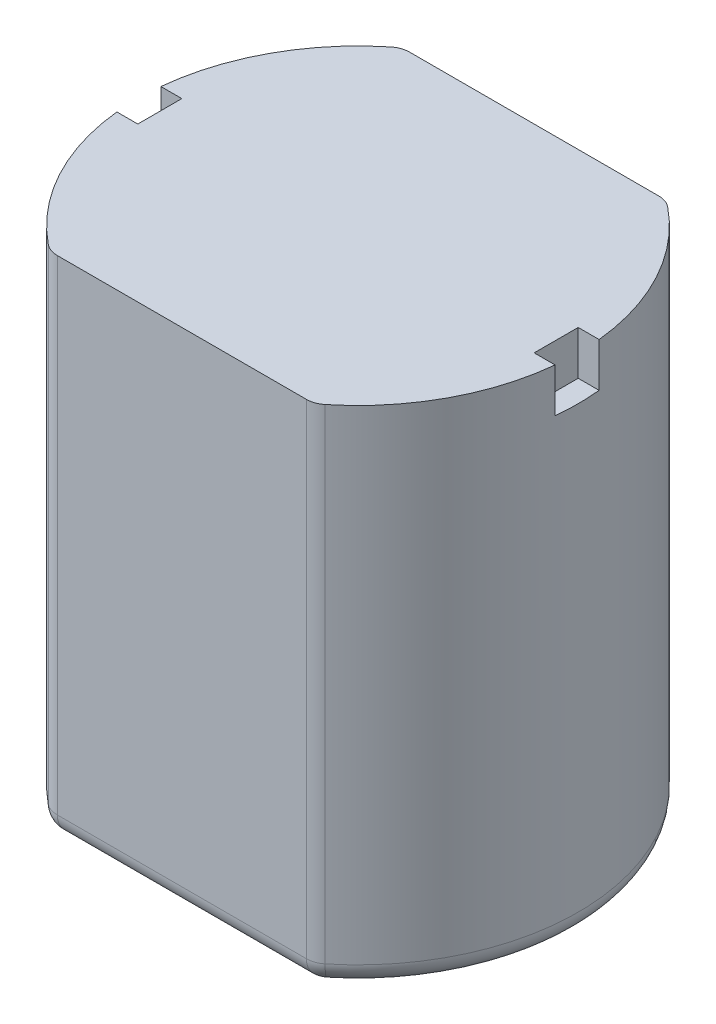
ISO-10303-21;
HEADER;
FILE_DESCRIPTION(('STEP AP214'),'2;1');
FILE_NAME('part.step','',(''),(''),'','','');
FILE_SCHEMA(('AUTOMOTIVE_DESIGN { 1 0 10303 214 1 1 1 1 }'));
ENDSEC;
DATA;
#1=APPLICATION_CONTEXT('core data for automotive mechanical design processes');
#2=APPLICATION_PROTOCOL_DEFINITION('international standard','automotive_design',2000,#1);
#3=PRODUCT_CONTEXT('',#1,'mechanical');
#4=PRODUCT('Part','Part','',(#3));
#5=PRODUCT_RELATED_PRODUCT_CATEGORY('part','',(#4));
#6=PRODUCT_DEFINITION_FORMATION('','',#4);
#7=PRODUCT_DEFINITION_CONTEXT('part definition',#1,'design');
#8=PRODUCT_DEFINITION('design','',#6,#7);
#9=PRODUCT_DEFINITION_SHAPE('','',#8);
#10=(LENGTH_UNIT() NAMED_UNIT(*) SI_UNIT(.MILLI.,.METRE.));
#11=(NAMED_UNIT(*) PLANE_ANGLE_UNIT() SI_UNIT($,.RADIAN.));
#12=(NAMED_UNIT(*) SI_UNIT($,.STERADIAN.) SOLID_ANGLE_UNIT());
#13=UNCERTAINTY_MEASURE_WITH_UNIT(LENGTH_MEASURE(1.E-05),#10,'distance_accuracy_value','');
#14=(GEOMETRIC_REPRESENTATION_CONTEXT(3) GLOBAL_UNCERTAINTY_ASSIGNED_CONTEXT((#13)) GLOBAL_UNIT_ASSIGNED_CONTEXT((#10,
#11,#12)) REPRESENTATION_CONTEXT('',''));
#15=CARTESIAN_POINT('',(0.,0.,0.));
#16=DIRECTION('',(0.,0.,1.));
#17=DIRECTION('',(1.,0.,0.));
#18=AXIS2_PLACEMENT_3D('',#15,#16,#17);
#19=CARTESIAN_POINT('',(0.,11.5,0.));
#20=DIRECTION('',(0.,-1.,0.));
#21=DIRECTION('',(0.,0.,-1.));
#22=AXIS2_PLACEMENT_3D('',#19,#20,#21);
#23=CYLINDRICAL_SURFACE('',#22,5.);
#24=DIRECTION('',(0.,-1.,0.));
#25=VECTOR('',#24,1.);
#26=CARTESIAN_POINT('',(-3.14269680527354,11.5,-3.88888888888889));
#27=LINE('',#26,#25);
#28=CARTESIAN_POINT('',(-3.14269680527354,11.5,-3.88888888888889));
#29=VERTEX_POINT('',#28);
#30=CARTESIAN_POINT('',(-3.14269680527354,0.5,-3.88888888888889));
#31=VERTEX_POINT('',#30);
#32=EDGE_CURVE('E248',#29,#31,#27,.T.);
#33=ORIENTED_EDGE('',*,*,#32,.T.);
#34=CARTESIAN_POINT('',(0.,0.5,0.));
#35=DIRECTION('',(0.,1.,0.));
#36=DIRECTION('',(0.,0.,1.));
#37=AXIS2_PLACEMENT_3D('',#34,#35,#36);
#38=CIRCLE('',#37,5.);
#39=CARTESIAN_POINT('',(-3.14269680527354,0.5,3.88888888888889));
#40=VERTEX_POINT('',#39);
#41=EDGE_CURVE('E45',#31,#40,#38,.T.);
#42=ORIENTED_EDGE('',*,*,#41,.T.);
#43=DIRECTION('',(0.,-1.,0.));
#44=VECTOR('',#43,1.);
#45=CARTESIAN_POINT('',(-3.14269680527354,11.5,3.88888888888889));
#46=LINE('',#45,#44);
#47=CARTESIAN_POINT('',(-3.14269680527354,11.5,3.88888888888889));
#48=VERTEX_POINT('',#47);
#49=EDGE_CURVE('E246',#40,#48,#46,.F.);
#50=ORIENTED_EDGE('',*,*,#49,.T.);
#51=CARTESIAN_POINT('',(0.,11.5,0.));
#52=DIRECTION('',(0.,1.,0.));
#53=DIRECTION('',(0.,0.,1.));
#54=AXIS2_PLACEMENT_3D('',#51,#52,#53);
#55=CIRCLE('',#54,5.);
#56=CARTESIAN_POINT('',(-4.9749371855331,11.5,0.5));
#57=VERTEX_POINT('',#56);
#58=EDGE_CURVE('E239',#57,#48,#55,.T.);
#59=ORIENTED_EDGE('',*,*,#58,.F.);
#60=DIRECTION('',(0.,-1.,0.));
#61=VECTOR('',#60,1.);
#62=CARTESIAN_POINT('',(-4.9749371855331,11.5,0.5));
#63=LINE('',#62,#61);
#64=CARTESIAN_POINT('',(-4.9749371855331,10.5,0.5));
#65=VERTEX_POINT('',#64);
#66=EDGE_CURVE('E199',#65,#57,#63,.F.);
#67=ORIENTED_EDGE('',*,*,#66,.F.);
#68=CARTESIAN_POINT('',(0.,10.5,0.));
#69=DIRECTION('',(0.,1.,0.));
#70=DIRECTION('',(0.,0.,1.));
#71=AXIS2_PLACEMENT_3D('',#68,#69,#70);
#72=CIRCLE('',#71,5.);
#73=CARTESIAN_POINT('',(-4.9749371855331,10.5,-0.5));
#74=VERTEX_POINT('',#73);
#75=EDGE_CURVE('E244',#74,#65,#72,.T.);
#76=ORIENTED_EDGE('',*,*,#75,.F.);
#77=DIRECTION('',(0.,-1.,0.));
#78=VECTOR('',#77,1.);
#79=CARTESIAN_POINT('',(-4.9749371855331,11.5,-0.5));
#80=LINE('',#79,#78);
#81=CARTESIAN_POINT('',(-4.9749371855331,11.5,-0.5));
#82=VERTEX_POINT('',#81);
#83=EDGE_CURVE('E197',#82,#74,#80,.T.);
#84=ORIENTED_EDGE('',*,*,#83,.F.);
#85=EDGE_CURVE('E189',#29,#82,#55,.T.);
#86=ORIENTED_EDGE('',*,*,#85,.F.);
#87=EDGE_LOOP('',(#33,#42,#50,#59,#67,#76,#84,#86));
#88=FACE_BOUND('',#87,.T.);
#89=ADVANCED_FACE('F37',(#88),#23,.T.);
#90=CARTESIAN_POINT('',(0.,11.5,0.));
#91=DIRECTION('',(0.,1.,0.));
#92=DIRECTION('',(0.,0.,1.));
#93=AXIS2_PLACEMENT_3D('',#90,#91,#92);
#94=PLANE('',#93);
#95=DIRECTION('',(1.,0.,0.));
#96=VECTOR('',#95,1.);
#97=CARTESIAN_POINT('',(-3.,11.5,-4.));
#98=LINE('',#97,#96);
#99=CARTESIAN_POINT('',(-2.82842712474619,11.5,-4.));
#100=VERTEX_POINT('',#99);
#101=CARTESIAN_POINT('',(2.82842712474619,11.5,-4.));
#102=VERTEX_POINT('',#101);
#103=EDGE_CURVE('E230',#100,#102,#98,.T.);
#104=ORIENTED_EDGE('',*,*,#103,.F.);
#105=CARTESIAN_POINT('',(-2.82842712474619,11.5,-3.5));
#106=DIRECTION('',(0.,1.,0.));
#107=DIRECTION('',(0.,0.,1.));
#108=AXIS2_PLACEMENT_3D('',#105,#106,#107);
#109=CIRCLE('',#108,0.5);
#110=EDGE_CURVE('E260',#100,#29,#109,.T.);
#111=ORIENTED_EDGE('',*,*,#110,.T.);
#112=ORIENTED_EDGE('',*,*,#85,.T.);
#113=DIRECTION('',(-1.,0.,0.));
#114=VECTOR('',#113,1.);
#115=CARTESIAN_POINT('',(-4.5,11.5,-0.5));
#116=LINE('',#115,#114);
#117=CARTESIAN_POINT('',(-4.5,11.5,-0.5));
#118=VERTEX_POINT('',#117);
#119=EDGE_CURVE('E170',#118,#82,#116,.T.);
#120=ORIENTED_EDGE('',*,*,#119,.F.);
#121=DIRECTION('',(0.,0.,1.));
#122=VECTOR('',#121,1.);
#123=CARTESIAN_POINT('',(-4.5,11.5,0.5));
#124=LINE('',#123,#122);
#125=CARTESIAN_POINT('',(-4.5,11.5,0.5));
#126=VERTEX_POINT('',#125);
#127=EDGE_CURVE('E176',#118,#126,#124,.T.);
#128=ORIENTED_EDGE('',*,*,#127,.T.);
#129=DIRECTION('',(-1.,0.,0.));
#130=VECTOR('',#129,1.);
#131=CARTESIAN_POINT('',(-4.5,11.5,0.5));
#132=LINE('',#131,#130);
#133=EDGE_CURVE('E190',#126,#57,#132,.T.);
#134=ORIENTED_EDGE('',*,*,#133,.T.);
#135=ORIENTED_EDGE('',*,*,#58,.T.);
#136=CARTESIAN_POINT('',(-2.82842712474619,11.5,3.5));
#137=DIRECTION('',(0.,1.,0.));
#138=DIRECTION('',(0.,0.,1.));
#139=AXIS2_PLACEMENT_3D('',#136,#137,#138);
#140=CIRCLE('',#139,0.5);
#141=CARTESIAN_POINT('',(-2.82842712474619,11.5,4.));
#142=VERTEX_POINT('',#141);
#143=EDGE_CURVE('E256',#48,#142,#140,.T.);
#144=ORIENTED_EDGE('',*,*,#143,.T.);
#145=DIRECTION('',(1.,0.,0.));
#146=VECTOR('',#145,1.);
#147=CARTESIAN_POINT('',(-3.,11.5,4.));
#148=LINE('',#147,#146);
#149=CARTESIAN_POINT('',(2.82842712474619,11.5,4.));
#150=VERTEX_POINT('',#149);
#151=EDGE_CURVE('E236',#142,#150,#148,.T.);
#152=ORIENTED_EDGE('',*,*,#151,.T.);
#153=CARTESIAN_POINT('',(2.82842712474619,11.5,3.5));
#154=DIRECTION('',(0.,1.,0.));
#155=DIRECTION('',(0.,0.,1.));
#156=AXIS2_PLACEMENT_3D('',#153,#154,#155);
#157=CIRCLE('',#156,0.5);
#158=CARTESIAN_POINT('',(3.14269680527354,11.5,3.88888888888889));
#159=VERTEX_POINT('',#158);
#160=EDGE_CURVE('E254',#150,#159,#157,.T.);
#161=ORIENTED_EDGE('',*,*,#160,.T.);
#162=CARTESIAN_POINT('',(0.,11.5,0.));
#163=DIRECTION('',(0.,1.,0.));
#164=DIRECTION('',(0.,0.,1.));
#165=AXIS2_PLACEMENT_3D('',#162,#163,#164);
#166=CIRCLE('',#165,5.);
#167=CARTESIAN_POINT('',(4.9749371855331,11.5,0.5));
#168=VERTEX_POINT('',#167);
#169=EDGE_CURVE('E234',#159,#168,#166,.T.);
#170=ORIENTED_EDGE('',*,*,#169,.T.);
#171=DIRECTION('',(1.,0.,0.));
#172=VECTOR('',#171,1.);
#173=CARTESIAN_POINT('',(4.5,11.5,0.5));
#174=LINE('',#173,#172);
#175=CARTESIAN_POINT('',(4.5,11.5,0.5));
#176=VERTEX_POINT('',#175);
#177=EDGE_CURVE('E213',#176,#168,#174,.T.);
#178=ORIENTED_EDGE('',*,*,#177,.F.);
#179=DIRECTION('',(0.,0.,1.));
#180=VECTOR('',#179,1.);
#181=CARTESIAN_POINT('',(4.5,11.5,0.5));
#182=LINE('',#181,#180);
#183=CARTESIAN_POINT('',(4.5,11.5,-0.5));
#184=VERTEX_POINT('',#183);
#185=EDGE_CURVE('E209',#184,#176,#182,.T.);
#186=ORIENTED_EDGE('',*,*,#185,.F.);
#187=DIRECTION('',(1.,0.,0.));
#188=VECTOR('',#187,1.);
#189=CARTESIAN_POINT('',(4.5,11.5,-0.5));
#190=LINE('',#189,#188);
#191=CARTESIAN_POINT('',(4.9749371855331,11.5,-0.5));
#192=VERTEX_POINT('',#191);
#193=EDGE_CURVE('E217',#184,#192,#190,.T.);
#194=ORIENTED_EDGE('',*,*,#193,.T.);
#195=CARTESIAN_POINT('',(3.14269680527354,11.5,-3.88888888888889));
#196=VERTEX_POINT('',#195);
#197=EDGE_CURVE('E233',#192,#196,#166,.T.);
#198=ORIENTED_EDGE('',*,*,#197,.T.);
#199=CARTESIAN_POINT('',(2.82842712474619,11.5,-3.5));
#200=DIRECTION('',(0.,1.,0.));
#201=DIRECTION('',(0.,0.,1.));
#202=AXIS2_PLACEMENT_3D('',#199,#200,#201);
#203=CIRCLE('',#202,0.5);
#204=EDGE_CURVE('E258',#196,#102,#203,.T.);
#205=ORIENTED_EDGE('',*,*,#204,.T.);
#206=EDGE_LOOP('',(#104,#111,#112,#120,#128,#134,#135,#144,#152,#161,#170,#178,#186,#194,#198,#205));
#207=FACE_BOUND('',#206,.T.);
#208=ADVANCED_FACE('F187',(#207),#94,.T.);
#209=CARTESIAN_POINT('',(-3.,11.5,-4.));
#210=DIRECTION('',(0.,0.,-1.));
#211=DIRECTION('',(-1.,0.,0.));
#212=AXIS2_PLACEMENT_3D('',#209,#210,#211);
#213=PLANE('',#212);
#214=DIRECTION('',(0.,1.,0.));
#215=VECTOR('',#214,1.);
#216=CARTESIAN_POINT('',(2.82842712474619,0.,-4.));
#217=LINE('',#216,#215);
#218=CARTESIAN_POINT('',(2.82842712474619,0.5,-4.));
#219=VERTEX_POINT('',#218);
#220=EDGE_CURVE('E250',#102,#219,#217,.F.);
#221=ORIENTED_EDGE('',*,*,#220,.T.);
#222=DIRECTION('',(1.,0.,0.));
#223=VECTOR('',#222,1.);
#224=CARTESIAN_POINT('',(-2.82842712474619,0.5,-4.));
#225=LINE('',#224,#223);
#226=CARTESIAN_POINT('',(-2.82842712474619,0.5,-4.));
#227=VERTEX_POINT('',#226);
#228=EDGE_CURVE('E60',#219,#227,#225,.F.);
#229=ORIENTED_EDGE('',*,*,#228,.T.);
#230=DIRECTION('',(0.,1.,0.));
#231=VECTOR('',#230,1.);
#232=CARTESIAN_POINT('',(-2.82842712474619,11.5,-4.));
#233=LINE('',#232,#231);
#234=EDGE_CURVE('E252',#227,#100,#233,.T.);
#235=ORIENTED_EDGE('',*,*,#234,.T.);
#236=ORIENTED_EDGE('',*,*,#103,.T.);
#237=EDGE_LOOP('',(#221,#229,#235,#236));
#238=FACE_BOUND('',#237,.T.);
#239=ADVANCED_FACE('F376',(#238),#213,.T.);
#240=CARTESIAN_POINT('',(-3.,11.5,4.));
#241=DIRECTION('',(0.,0.,-1.));
#242=DIRECTION('',(-1.,0.,0.));
#243=AXIS2_PLACEMENT_3D('',#240,#241,#242);
#244=PLANE('',#243);
#245=DIRECTION('',(0.,-1.,0.));
#246=VECTOR('',#245,1.);
#247=CARTESIAN_POINT('',(-2.82842712474619,11.5,4.));
#248=LINE('',#247,#246);
#249=CARTESIAN_POINT('',(-2.82842712474619,0.5,4.));
#250=VERTEX_POINT('',#249);
#251=EDGE_CURVE('E269',#142,#250,#248,.T.);
#252=ORIENTED_EDGE('',*,*,#251,.T.);
#253=DIRECTION('',(1.,0.,0.));
#254=VECTOR('',#253,1.);
#255=CARTESIAN_POINT('',(-3.,0.5,4.));
#256=LINE('',#255,#254);
#257=CARTESIAN_POINT('',(2.82842712474619,0.5,4.));
#258=VERTEX_POINT('',#257);
#259=EDGE_CURVE('E275',#250,#258,#256,.T.);
#260=ORIENTED_EDGE('',*,*,#259,.T.);
#261=DIRECTION('',(0.,-1.,0.));
#262=VECTOR('',#261,1.);
#263=CARTESIAN_POINT('',(2.82842712474619,11.5,4.));
#264=LINE('',#263,#262);
#265=EDGE_CURVE('E267',#258,#150,#264,.F.);
#266=ORIENTED_EDGE('',*,*,#265,.T.);
#267=ORIENTED_EDGE('',*,*,#151,.F.);
#268=EDGE_LOOP('',(#252,#260,#266,#267));
#269=FACE_BOUND('',#268,.T.);
#270=ADVANCED_FACE('F341',(#269),#244,.F.);
#271=CARTESIAN_POINT('',(0.,11.5,0.));
#272=DIRECTION('',(0.,-1.,0.));
#273=DIRECTION('',(0.,0.,-1.));
#274=AXIS2_PLACEMENT_3D('',#271,#272,#273);
#275=CYLINDRICAL_SURFACE('',#274,5.);
#276=DIRECTION('',(0.,-1.,0.));
#277=VECTOR('',#276,1.);
#278=CARTESIAN_POINT('',(3.14269680527354,11.5,3.88888888888889));
#279=LINE('',#278,#277);
#280=CARTESIAN_POINT('',(3.14269680527354,0.5,3.88888888888889));
#281=VERTEX_POINT('',#280);
#282=EDGE_CURVE('E262',#159,#281,#279,.T.);
#283=ORIENTED_EDGE('',*,*,#282,.T.);
#284=CARTESIAN_POINT('',(0.,0.5,0.));
#285=DIRECTION('',(0.,1.,0.));
#286=DIRECTION('',(0.,0.,1.));
#287=AXIS2_PLACEMENT_3D('',#284,#285,#286);
#288=CIRCLE('',#287,5.);
#289=CARTESIAN_POINT('',(3.14269680527354,0.5,-3.88888888888889));
#290=VERTEX_POINT('',#289);
#291=EDGE_CURVE('E288',#281,#290,#288,.T.);
#292=ORIENTED_EDGE('',*,*,#291,.T.);
#293=DIRECTION('',(0.,-1.,0.));
#294=VECTOR('',#293,1.);
#295=CARTESIAN_POINT('',(3.14269680527354,11.5,-3.88888888888889));
#296=LINE('',#295,#294);
#297=EDGE_CURVE('E265',#290,#196,#296,.F.);
#298=ORIENTED_EDGE('',*,*,#297,.T.);
#299=ORIENTED_EDGE('',*,*,#197,.F.);
#300=DIRECTION('',(0.,-1.,0.));
#301=VECTOR('',#300,1.);
#302=CARTESIAN_POINT('',(4.9749371855331,11.5,-0.5));
#303=LINE('',#302,#301);
#304=CARTESIAN_POINT('',(4.9749371855331,10.5,-0.5));
#305=VERTEX_POINT('',#304);
#306=EDGE_CURVE('E216',#192,#305,#303,.T.);
#307=ORIENTED_EDGE('',*,*,#306,.T.);
#308=CARTESIAN_POINT('',(0.,10.5,0.));
#309=DIRECTION('',(0.,-1.,0.));
#310=DIRECTION('',(0.,0.,-1.));
#311=AXIS2_PLACEMENT_3D('',#308,#309,#310);
#312=CIRCLE('',#311,5.);
#313=CARTESIAN_POINT('',(4.9749371855331,10.5,0.5));
#314=VERTEX_POINT('',#313);
#315=EDGE_CURVE('E241',#305,#314,#312,.T.);
#316=ORIENTED_EDGE('',*,*,#315,.T.);
#317=DIRECTION('',(0.,-1.,0.));
#318=VECTOR('',#317,1.);
#319=CARTESIAN_POINT('',(4.9749371855331,11.5,0.5));
#320=LINE('',#319,#318);
#321=EDGE_CURVE('E227',#314,#168,#320,.F.);
#322=ORIENTED_EDGE('',*,*,#321,.T.);
#323=ORIENTED_EDGE('',*,*,#169,.F.);
#324=EDGE_LOOP('',(#283,#292,#298,#299,#307,#316,#322,#323));
#325=FACE_BOUND('',#324,.T.);
#326=ADVANCED_FACE('F351',(#325),#275,.T.);
#327=CARTESIAN_POINT('',(0.,0.,0.));
#328=DIRECTION('',(0.,1.,0.));
#329=DIRECTION('',(0.,0.,1.));
#330=AXIS2_PLACEMENT_3D('',#327,#328,#329);
#331=PLANE('',#330);
#332=CARTESIAN_POINT('',(-3.,0.,0.));
#333=DIRECTION('',(0.,-1.,0.));
#334=DIRECTION('',(0.,0.,-1.));
#335=AXIS2_PLACEMENT_3D('',#332,#333,#334);
#336=CIRCLE('',#335,0.376312748616978);
#337=CARTESIAN_POINT('',(-3.,0.,-0.376312748616978));
#338=VERTEX_POINT('',#337);
#339=EDGE_CURVE('E708',#338,#338,#336,.T.);
#340=ORIENTED_EDGE('',*,*,#339,.F.);
#341=EDGE_LOOP('',(#340));
#342=FACE_BOUND('',#341,.T.);
#343=CARTESIAN_POINT('',(3.,0.,0.));
#344=DIRECTION('',(0.,-1.,0.));
#345=DIRECTION('',(0.,0.,-1.));
#346=AXIS2_PLACEMENT_3D('',#343,#344,#345);
#347=CIRCLE('',#346,0.431953984557101);
#348=CARTESIAN_POINT('',(3.,0.,-0.431953984557101));
#349=VERTEX_POINT('',#348);
#350=EDGE_CURVE('E718',#349,#349,#347,.T.);
#351=ORIENTED_EDGE('',*,*,#350,.F.);
#352=EDGE_LOOP('',(#351));
#353=FACE_BOUND('',#352,.T.);
#354=CARTESIAN_POINT('',(0.,0.,0.));
#355=DIRECTION('',(0.,1.,0.));
#356=DIRECTION('',(0.,0.,1.));
#357=AXIS2_PLACEMENT_3D('',#354,#355,#356);
#358=CIRCLE('',#357,2.);
#359=CARTESIAN_POINT('',(0.,0.,2.));
#360=VERTEX_POINT('',#359);
#361=EDGE_CURVE('E11',#360,#360,#358,.F.);
#362=ORIENTED_EDGE('',*,*,#361,.F.);
#363=EDGE_LOOP('',(#362));
#364=FACE_BOUND('',#363,.T.);
#365=CARTESIAN_POINT('',(0.,0.,0.));
#366=DIRECTION('',(0.,1.,0.));
#367=DIRECTION('',(0.,0.,1.));
#368=AXIS2_PLACEMENT_3D('',#365,#366,#367);
#369=CIRCLE('',#368,4.5);
#370=CARTESIAN_POINT('',(2.82842712474619,0.,-3.5));
#371=VERTEX_POINT('',#370);
#372=CARTESIAN_POINT('',(2.82842712474619,0.,3.5));
#373=VERTEX_POINT('',#372);
#374=EDGE_CURVE('E281',#371,#373,#369,.F.);
#375=ORIENTED_EDGE('',*,*,#374,.T.);
#376=DIRECTION('',(1.,0.,0.));
#377=VECTOR('',#376,1.);
#378=CARTESIAN_POINT('',(0.,0.,3.5));
#379=LINE('',#378,#377);
#380=CARTESIAN_POINT('',(-2.82842712474619,0.,3.5));
#381=VERTEX_POINT('',#380);
#382=EDGE_CURVE('E283',#373,#381,#379,.F.);
#383=ORIENTED_EDGE('',*,*,#382,.T.);
#384=CARTESIAN_POINT('',(0.,0.,0.));
#385=DIRECTION('',(0.,1.,0.));
#386=DIRECTION('',(0.,0.,1.));
#387=AXIS2_PLACEMENT_3D('',#384,#385,#386);
#388=CIRCLE('',#387,4.5);
#389=CARTESIAN_POINT('',(-2.82842712474619,0.,-3.5));
#390=VERTEX_POINT('',#389);
#391=EDGE_CURVE('E277',#381,#390,#388,.F.);
#392=ORIENTED_EDGE('',*,*,#391,.T.);
#393=DIRECTION('',(1.,0.,0.));
#394=VECTOR('',#393,1.);
#395=CARTESIAN_POINT('',(2.82842712474619,0.,-3.5));
#396=LINE('',#395,#394);
#397=EDGE_CURVE('E279',#390,#371,#396,.T.);
#398=ORIENTED_EDGE('',*,*,#397,.T.);
#399=EDGE_LOOP('',(#375,#383,#392,#398));
#400=FACE_BOUND('',#399,.T.);
#401=ADVANCED_FACE('F364',(#342,#353,#364,#400),#331,.F.);
#402=CARTESIAN_POINT('',(4.5,10.5,0.5));
#403=DIRECTION('',(0.,-1.,0.));
#404=DIRECTION('',(0.,0.,-1.));
#405=AXIS2_PLACEMENT_3D('',#402,#403,#404);
#406=PLANE('',#405);
#407=DIRECTION('',(1.,0.,0.));
#408=VECTOR('',#407,1.);
#409=CARTESIAN_POINT('',(4.5,10.5,-0.5));
#410=LINE('',#409,#408);
#411=CARTESIAN_POINT('',(4.5,10.5,-0.5));
#412=VERTEX_POINT('',#411);
#413=EDGE_CURVE('E220',#412,#305,#410,.T.);
#414=ORIENTED_EDGE('',*,*,#413,.F.);
#415=DIRECTION('',(0.,0.,-1.));
#416=VECTOR('',#415,1.);
#417=CARTESIAN_POINT('',(4.5,10.5,0.5));
#418=LINE('',#417,#416);
#419=CARTESIAN_POINT('',(4.5,10.5,0.5));
#420=VERTEX_POINT('',#419);
#421=EDGE_CURVE('E204',#420,#412,#418,.T.);
#422=ORIENTED_EDGE('',*,*,#421,.F.);
#423=DIRECTION('',(1.,0.,0.));
#424=VECTOR('',#423,1.);
#425=CARTESIAN_POINT('',(4.5,10.5,0.5));
#426=LINE('',#425,#424);
#427=EDGE_CURVE('E212',#420,#314,#426,.T.);
#428=ORIENTED_EDGE('',*,*,#427,.T.);
#429=ORIENTED_EDGE('',*,*,#315,.F.);
#430=EDGE_LOOP('',(#414,#422,#428,#429));
#431=FACE_BOUND('',#430,.T.);
#432=ADVANCED_FACE('F499',(#431),#406,.F.);
#433=CARTESIAN_POINT('',(4.5,11.5,0.5));
#434=DIRECTION('',(0.,0.,1.));
#435=DIRECTION('',(0.,-1.,0.));
#436=AXIS2_PLACEMENT_3D('',#433,#434,#435);
#437=PLANE('',#436);
#438=ORIENTED_EDGE('',*,*,#427,.F.);
#439=DIRECTION('',(0.,-1.,0.));
#440=VECTOR('',#439,1.);
#441=CARTESIAN_POINT('',(4.5,11.5,0.5));
#442=LINE('',#441,#440);
#443=EDGE_CURVE('E201',#176,#420,#442,.T.);
#444=ORIENTED_EDGE('',*,*,#443,.F.);
#445=ORIENTED_EDGE('',*,*,#177,.T.);
#446=ORIENTED_EDGE('',*,*,#321,.F.);
#447=EDGE_LOOP('',(#438,#444,#445,#446));
#448=FACE_BOUND('',#447,.T.);
#449=ADVANCED_FACE('F560',(#448),#437,.F.);
#450=CARTESIAN_POINT('',(4.5,11.5,-0.5));
#451=DIRECTION('',(0.,0.,-1.));
#452=DIRECTION('',(0.,1.,0.));
#453=AXIS2_PLACEMENT_3D('',#450,#451,#452);
#454=PLANE('',#453);
#455=ORIENTED_EDGE('',*,*,#193,.F.);
#456=DIRECTION('',(0.,1.,0.));
#457=VECTOR('',#456,1.);
#458=CARTESIAN_POINT('',(4.5,11.5,-0.5));
#459=LINE('',#458,#457);
#460=EDGE_CURVE('E207',#412,#184,#459,.T.);
#461=ORIENTED_EDGE('',*,*,#460,.F.);
#462=ORIENTED_EDGE('',*,*,#413,.T.);
#463=ORIENTED_EDGE('',*,*,#306,.F.);
#464=EDGE_LOOP('',(#455,#461,#462,#463));
#465=FACE_BOUND('',#464,.T.);
#466=ADVANCED_FACE('F556',(#465),#454,.F.);
#467=CARTESIAN_POINT('',(4.5,0.,0.));
#468=DIRECTION('',(1.,0.,0.));
#469=DIRECTION('',(0.,0.,-1.));
#470=AXIS2_PLACEMENT_3D('',#467,#468,#469);
#471=PLANE('',#470);
#472=ORIENTED_EDGE('',*,*,#443,.T.);
#473=ORIENTED_EDGE('',*,*,#421,.T.);
#474=ORIENTED_EDGE('',*,*,#460,.T.);
#475=ORIENTED_EDGE('',*,*,#185,.T.);
#476=EDGE_LOOP('',(#472,#473,#474,#475));
#477=FACE_BOUND('',#476,.T.);
#478=ADVANCED_FACE('F549',(#477),#471,.T.);
#479=CARTESIAN_POINT('',(-4.5,10.5,0.5));
#480=DIRECTION('',(0.,1.,0.));
#481=DIRECTION('',(0.,0.,1.));
#482=AXIS2_PLACEMENT_3D('',#479,#480,#481);
#483=PLANE('',#482);
#484=DIRECTION('',(-1.,0.,0.));
#485=VECTOR('',#484,1.);
#486=CARTESIAN_POINT('',(-4.5,10.5,-0.5));
#487=LINE('',#486,#485);
#488=CARTESIAN_POINT('',(-4.5,10.5,-0.5));
#489=VERTEX_POINT('',#488);
#490=EDGE_CURVE('E173',#489,#74,#487,.T.);
#491=ORIENTED_EDGE('',*,*,#490,.T.);
#492=ORIENTED_EDGE('',*,*,#75,.T.);
#493=DIRECTION('',(-1.,0.,0.));
#494=VECTOR('',#493,1.);
#495=CARTESIAN_POINT('',(-4.5,10.5,0.5));
#496=LINE('',#495,#494);
#497=CARTESIAN_POINT('',(-4.5,10.5,0.5));
#498=VERTEX_POINT('',#497);
#499=EDGE_CURVE('E192',#498,#65,#496,.T.);
#500=ORIENTED_EDGE('',*,*,#499,.F.);
#501=DIRECTION('',(0.,0.,-1.));
#502=VECTOR('',#501,1.);
#503=CARTESIAN_POINT('',(-4.5,10.5,0.5));
#504=LINE('',#503,#502);
#505=EDGE_CURVE('E175',#498,#489,#504,.T.);
#506=ORIENTED_EDGE('',*,*,#505,.T.);
#507=EDGE_LOOP('',(#491,#492,#500,#506));
#508=FACE_BOUND('',#507,.T.);
#509=ADVANCED_FACE('F546',(#508),#483,.T.);
#510=CARTESIAN_POINT('',(-4.5,11.5,0.5));
#511=DIRECTION('',(0.,0.,-1.));
#512=DIRECTION('',(0.,1.,0.));
#513=AXIS2_PLACEMENT_3D('',#510,#511,#512);
#514=PLANE('',#513);
#515=ORIENTED_EDGE('',*,*,#66,.T.);
#516=ORIENTED_EDGE('',*,*,#133,.F.);
#517=DIRECTION('',(0.,-1.,0.));
#518=VECTOR('',#517,1.);
#519=CARTESIAN_POINT('',(-4.5,11.5,0.5));
#520=LINE('',#519,#518);
#521=EDGE_CURVE('E181',#126,#498,#520,.T.);
#522=ORIENTED_EDGE('',*,*,#521,.T.);
#523=ORIENTED_EDGE('',*,*,#499,.T.);
#524=EDGE_LOOP('',(#515,#516,#522,#523));
#525=FACE_BOUND('',#524,.T.);
#526=ADVANCED_FACE('F328',(#525),#514,.T.);
#527=CARTESIAN_POINT('',(-4.5,11.5,-0.5));
#528=DIRECTION('',(0.,0.,1.));
#529=DIRECTION('',(0.,-1.,0.));
#530=AXIS2_PLACEMENT_3D('',#527,#528,#529);
#531=PLANE('',#530);
#532=ORIENTED_EDGE('',*,*,#83,.T.);
#533=ORIENTED_EDGE('',*,*,#490,.F.);
#534=DIRECTION('',(0.,1.,0.));
#535=VECTOR('',#534,1.);
#536=CARTESIAN_POINT('',(-4.5,11.5,-0.5));
#537=LINE('',#536,#535);
#538=EDGE_CURVE('E165',#489,#118,#537,.T.);
#539=ORIENTED_EDGE('',*,*,#538,.T.);
#540=ORIENTED_EDGE('',*,*,#119,.T.);
#541=EDGE_LOOP('',(#532,#533,#539,#540));
#542=FACE_BOUND('',#541,.T.);
#543=ADVANCED_FACE('F168',(#542),#531,.T.);
#544=CARTESIAN_POINT('',(-4.5,0.,0.));
#545=DIRECTION('',(-1.,0.,0.));
#546=DIRECTION('',(0.,0.,-1.));
#547=AXIS2_PLACEMENT_3D('',#544,#545,#546);
#548=PLANE('',#547);
#549=ORIENTED_EDGE('',*,*,#521,.F.);
#550=ORIENTED_EDGE('',*,*,#127,.F.);
#551=ORIENTED_EDGE('',*,*,#538,.F.);
#552=ORIENTED_EDGE('',*,*,#505,.F.);
#553=EDGE_LOOP('',(#549,#550,#551,#552));
#554=FACE_BOUND('',#553,.T.);
#555=ADVANCED_FACE('F179',(#554),#548,.T.);
#556=CARTESIAN_POINT('',(-2.82842712474619,11.5,-3.5));
#557=DIRECTION('',(0.,-1.,0.));
#558=DIRECTION('',(0.,0.,-1.));
#559=AXIS2_PLACEMENT_3D('',#556,#557,#558);
#560=CYLINDRICAL_SURFACE('',#559,0.5);
#561=ORIENTED_EDGE('',*,*,#234,.F.);
#562=CARTESIAN_POINT('',(-2.82842712474619,0.5,-3.5));
#563=DIRECTION('',(0.,-1.,0.));
#564=DIRECTION('',(0.,0.,-1.));
#565=AXIS2_PLACEMENT_3D('',#562,#563,#564);
#566=CIRCLE('',#565,0.5);
#567=EDGE_CURVE('E52',#227,#31,#566,.F.);
#568=ORIENTED_EDGE('',*,*,#567,.T.);
#569=ORIENTED_EDGE('',*,*,#32,.F.);
#570=ORIENTED_EDGE('',*,*,#110,.F.);
#571=EDGE_LOOP('',(#561,#568,#569,#570));
#572=FACE_BOUND('',#571,.T.);
#573=ADVANCED_FACE('F379',(#572),#560,.T.);
#574=CARTESIAN_POINT('',(2.82842712474619,11.5,-3.5));
#575=DIRECTION('',(0.,-1.,0.));
#576=DIRECTION('',(0.,0.,-1.));
#577=AXIS2_PLACEMENT_3D('',#574,#575,#576);
#578=CYLINDRICAL_SURFACE('',#577,0.5);
#579=ORIENTED_EDGE('',*,*,#297,.F.);
#580=CARTESIAN_POINT('',(2.82842712474619,0.5,-3.5));
#581=DIRECTION('',(0.,-1.,0.));
#582=DIRECTION('',(0.,0.,-1.));
#583=AXIS2_PLACEMENT_3D('',#580,#581,#582);
#584=CIRCLE('',#583,0.5);
#585=EDGE_CURVE('E290',#290,#219,#584,.F.);
#586=ORIENTED_EDGE('',*,*,#585,.T.);
#587=ORIENTED_EDGE('',*,*,#220,.F.);
#588=ORIENTED_EDGE('',*,*,#204,.F.);
#589=EDGE_LOOP('',(#579,#586,#587,#588));
#590=FACE_BOUND('',#589,.T.);
#591=ADVANCED_FACE('F374',(#590),#578,.T.);
#592=CARTESIAN_POINT('',(-2.82842712474619,11.5,3.5));
#593=DIRECTION('',(0.,-1.,0.));
#594=DIRECTION('',(0.,0.,-1.));
#595=AXIS2_PLACEMENT_3D('',#592,#593,#594);
#596=CYLINDRICAL_SURFACE('',#595,0.5);
#597=ORIENTED_EDGE('',*,*,#49,.F.);
#598=CARTESIAN_POINT('',(-2.82842712474619,0.5,3.5));
#599=DIRECTION('',(0.,-1.,0.));
#600=DIRECTION('',(0.,0.,-1.));
#601=AXIS2_PLACEMENT_3D('',#598,#599,#600);
#602=CIRCLE('',#601,0.5);
#603=EDGE_CURVE('E272',#40,#250,#602,.F.);
#604=ORIENTED_EDGE('',*,*,#603,.T.);
#605=ORIENTED_EDGE('',*,*,#251,.F.);
#606=ORIENTED_EDGE('',*,*,#143,.F.);
#607=EDGE_LOOP('',(#597,#604,#605,#606));
#608=FACE_BOUND('',#607,.T.);
#609=ADVANCED_FACE('F338',(#608),#596,.T.);
#610=CARTESIAN_POINT('',(2.82842712474619,11.5,3.5));
#611=DIRECTION('',(0.,-1.,0.));
#612=DIRECTION('',(0.,0.,-1.));
#613=AXIS2_PLACEMENT_3D('',#610,#611,#612);
#614=CYLINDRICAL_SURFACE('',#613,0.5);
#615=ORIENTED_EDGE('',*,*,#265,.F.);
#616=CARTESIAN_POINT('',(2.82842712474619,0.5,3.5));
#617=DIRECTION('',(0.,-1.,0.));
#618=DIRECTION('',(0.,0.,-1.));
#619=AXIS2_PLACEMENT_3D('',#616,#617,#618);
#620=CIRCLE('',#619,0.5);
#621=EDGE_CURVE('E286',#258,#281,#620,.F.);
#622=ORIENTED_EDGE('',*,*,#621,.T.);
#623=ORIENTED_EDGE('',*,*,#282,.F.);
#624=ORIENTED_EDGE('',*,*,#160,.F.);
#625=EDGE_LOOP('',(#615,#622,#623,#624));
#626=FACE_BOUND('',#625,.T.);
#627=ADVANCED_FACE('F348',(#626),#614,.T.);
#628=CARTESIAN_POINT('',(2.82842712474619,0.5,-3.5));
#629=DIRECTION('',(0.,1.,0.));
#630=DIRECTION('',(0.,0.,1.));
#631=AXIS2_PLACEMENT_3D('',#628,#629,#630);
#632=SPHERICAL_SURFACE('',#631,0.5);
#633=CARTESIAN_POINT('',(2.82842712474619,0.5,-3.5));
#634=DIRECTION('',(-1.,0.,0.));
#635=DIRECTION('',(0.,0.,1.));
#636=AXIS2_PLACEMENT_3D('',#633,#634,#635);
#637=CIRCLE('',#636,0.5);
#638=EDGE_CURVE('E312',#219,#371,#637,.T.);
#639=ORIENTED_EDGE('',*,*,#638,.F.);
#640=ORIENTED_EDGE('',*,*,#585,.F.);
#641=CARTESIAN_POINT('',(2.82842712474619,0.5,-3.5));
#642=DIRECTION('',(0.777777777777778,0.,0.628539361054709));
#643=DIRECTION('',(0.628539361054709,0.,-0.777777777777778));
#644=AXIS2_PLACEMENT_3D('',#641,#642,#643);
#645=CIRCLE('',#644,0.5);
#646=EDGE_CURVE('E314',#371,#290,#645,.T.);
#647=ORIENTED_EDGE('',*,*,#646,.F.);
#648=EDGE_LOOP('',(#639,#640,#647));
#649=FACE_BOUND('',#648,.T.);
#650=ADVANCED_FACE('F39',(#649),#632,.T.);
#651=CARTESIAN_POINT('',(0.,0.5,0.));
#652=DIRECTION('',(0.,1.,0.));
#653=DIRECTION('',(0.,0.,1.));
#654=AXIS2_PLACEMENT_3D('',#651,#652,#653);
#655=TOROIDAL_SURFACE('',#654,4.5,0.5);
#656=ORIENTED_EDGE('',*,*,#646,.T.);
#657=ORIENTED_EDGE('',*,*,#291,.F.);
#658=CARTESIAN_POINT('',(2.82842712474619,0.5,3.5));
#659=DIRECTION('',(-0.777777777777778,0.,0.628539361054709));
#660=DIRECTION('',(0.628539361054709,0.,0.777777777777778));
#661=AXIS2_PLACEMENT_3D('',#658,#659,#660);
#662=CIRCLE('',#661,0.5);
#663=EDGE_CURVE('E309',#373,#281,#662,.T.);
#664=ORIENTED_EDGE('',*,*,#663,.F.);
#665=ORIENTED_EDGE('',*,*,#374,.F.);
#666=EDGE_LOOP('',(#656,#657,#664,#665));
#667=FACE_BOUND('',#666,.T.);
#668=ADVANCED_FACE('F354',(#667),#655,.T.);
#669=CARTESIAN_POINT('',(0.,0.5,-3.5));
#670=DIRECTION('',(-1.,0.,0.));
#671=DIRECTION('',(0.,0.,1.));
#672=AXIS2_PLACEMENT_3D('',#669,#670,#671);
#673=CYLINDRICAL_SURFACE('',#672,0.5);
#674=ORIENTED_EDGE('',*,*,#638,.T.);
#675=ORIENTED_EDGE('',*,*,#397,.F.);
#676=CARTESIAN_POINT('',(-2.82842712474619,0.5,-3.5));
#677=DIRECTION('',(-1.,0.,0.));
#678=DIRECTION('',(0.,0.,1.));
#679=AXIS2_PLACEMENT_3D('',#676,#677,#678);
#680=CIRCLE('',#679,0.5);
#681=EDGE_CURVE('E306',#227,#390,#680,.T.);
#682=ORIENTED_EDGE('',*,*,#681,.F.);
#683=ORIENTED_EDGE('',*,*,#228,.F.);
#684=EDGE_LOOP('',(#674,#675,#682,#683));
#685=FACE_BOUND('',#684,.T.);
#686=ADVANCED_FACE('F369',(#685),#673,.T.);
#687=CARTESIAN_POINT('',(2.82842712474619,0.5,3.5));
#688=DIRECTION('',(0.,1.,0.));
#689=DIRECTION('',(0.,0.,1.));
#690=AXIS2_PLACEMENT_3D('',#687,#688,#689);
#691=SPHERICAL_SURFACE('',#690,0.5);
#692=ORIENTED_EDGE('',*,*,#663,.T.);
#693=ORIENTED_EDGE('',*,*,#621,.F.);
#694=CARTESIAN_POINT('',(2.82842712474619,0.5,3.5));
#695=DIRECTION('',(-1.,0.,0.));
#696=DIRECTION('',(0.,0.,1.));
#697=AXIS2_PLACEMENT_3D('',#694,#695,#696);
#698=CIRCLE('',#697,0.5);
#699=EDGE_CURVE('E303',#373,#258,#698,.T.);
#700=ORIENTED_EDGE('',*,*,#699,.F.);
#701=EDGE_LOOP('',(#692,#693,#700));
#702=FACE_BOUND('',#701,.T.);
#703=ADVANCED_FACE('F357',(#702),#691,.T.);
#704=CARTESIAN_POINT('',(-2.82842712474619,0.5,-3.5));
#705=DIRECTION('',(0.,1.,0.));
#706=DIRECTION('',(0.,0.,1.));
#707=AXIS2_PLACEMENT_3D('',#704,#705,#706);
#708=SPHERICAL_SURFACE('',#707,0.5);
#709=ORIENTED_EDGE('',*,*,#567,.F.);
#710=ORIENTED_EDGE('',*,*,#681,.T.);
#711=CARTESIAN_POINT('',(-2.82842712474619,0.5,-3.5));
#712=DIRECTION('',(-0.777777777777778,0.,0.628539361054708));
#713=DIRECTION('',(0.628539361054709,0.,0.777777777777778));
#714=AXIS2_PLACEMENT_3D('',#711,#712,#713);
#715=CIRCLE('',#714,0.5);
#716=EDGE_CURVE('E300',#31,#390,#715,.T.);
#717=ORIENTED_EDGE('',*,*,#716,.F.);
#718=EDGE_LOOP('',(#709,#710,#717));
#719=FACE_BOUND('',#718,.T.);
#720=ADVANCED_FACE('F383',(#719),#708,.T.);
#721=CARTESIAN_POINT('',(-3.,0.5,3.5));
#722=DIRECTION('',(1.,0.,0.));
#723=DIRECTION('',(0.,0.,-1.));
#724=AXIS2_PLACEMENT_3D('',#721,#722,#723);
#725=CYLINDRICAL_SURFACE('',#724,0.5);
#726=ORIENTED_EDGE('',*,*,#699,.T.);
#727=ORIENTED_EDGE('',*,*,#259,.F.);
#728=CARTESIAN_POINT('',(-2.82842712474619,0.5,3.5));
#729=DIRECTION('',(-1.,0.,0.));
#730=DIRECTION('',(0.,0.,1.));
#731=AXIS2_PLACEMENT_3D('',#728,#729,#730);
#732=CIRCLE('',#731,0.5);
#733=EDGE_CURVE('E297',#381,#250,#732,.T.);
#734=ORIENTED_EDGE('',*,*,#733,.F.);
#735=ORIENTED_EDGE('',*,*,#382,.F.);
#736=EDGE_LOOP('',(#726,#727,#734,#735));
#737=FACE_BOUND('',#736,.T.);
#738=ADVANCED_FACE('F361',(#737),#725,.T.);
#739=CARTESIAN_POINT('',(0.,0.5,0.));
#740=DIRECTION('',(0.,1.,0.));
#741=DIRECTION('',(0.,0.,1.));
#742=AXIS2_PLACEMENT_3D('',#739,#740,#741);
#743=TOROIDAL_SURFACE('',#742,4.5,0.5);
#744=ORIENTED_EDGE('',*,*,#716,.T.);
#745=ORIENTED_EDGE('',*,*,#391,.F.);
#746=CARTESIAN_POINT('',(-2.82842712474619,0.5,3.5));
#747=DIRECTION('',(0.777777777777778,0.,0.628539361054709));
#748=DIRECTION('',(0.628539361054709,0.,-0.777777777777778));
#749=AXIS2_PLACEMENT_3D('',#746,#747,#748);
#750=CIRCLE('',#749,0.5);
#751=EDGE_CURVE('E295',#40,#381,#750,.T.);
#752=ORIENTED_EDGE('',*,*,#751,.F.);
#753=ORIENTED_EDGE('',*,*,#41,.F.);
#754=EDGE_LOOP('',(#744,#745,#752,#753));
#755=FACE_BOUND('',#754,.T.);
#756=ADVANCED_FACE('F386',(#755),#743,.T.);
#757=CARTESIAN_POINT('',(-2.82842712474619,0.5,3.5));
#758=DIRECTION('',(0.,1.,0.));
#759=DIRECTION('',(0.,0.,1.));
#760=AXIS2_PLACEMENT_3D('',#757,#758,#759);
#761=SPHERICAL_SURFACE('',#760,0.5);
#762=ORIENTED_EDGE('',*,*,#733,.T.);
#763=ORIENTED_EDGE('',*,*,#603,.F.);
#764=ORIENTED_EDGE('',*,*,#751,.T.);
#765=EDGE_LOOP('',(#762,#763,#764));
#766=FACE_BOUND('',#765,.T.);
#767=ADVANCED_FACE('F388',(#766),#761,.T.);
#768=CARTESIAN_POINT('',(0.,-0.25,0.));
#769=DIRECTION('',(0.,1.,0.));
#770=DIRECTION('',(0.,0.,1.));
#771=AXIS2_PLACEMENT_3D('',#768,#769,#770);
#772=CYLINDRICAL_SURFACE('',#771,2.);
#773=CARTESIAN_POINT('',(0.,-0.25,0.));
#774=DIRECTION('',(0.,-1.,0.));
#775=DIRECTION('',(0.,0.,-1.));
#776=AXIS2_PLACEMENT_3D('',#773,#774,#775);
#777=CIRCLE('',#776,2.);
#778=CARTESIAN_POINT('',(0.,-0.25,-2.));
#779=VERTEX_POINT('',#778);
#780=EDGE_CURVE('E298',#779,#779,#777,.T.);
#781=ORIENTED_EDGE('',*,*,#780,.F.);
#782=EDGE_LOOP('',(#781));
#783=FACE_BOUND('',#782,.T.);
#784=ORIENTED_EDGE('',*,*,#361,.T.);
#785=EDGE_LOOP('',(#784));
#786=FACE_BOUND('',#785,.T.);
#787=ADVANCED_FACE('F390',(#783,#786),#772,.T.);
#788=CARTESIAN_POINT('',(0.,-0.25,0.));
#789=DIRECTION('',(0.,-1.,0.));
#790=DIRECTION('',(0.,0.,-1.));
#791=AXIS2_PLACEMENT_3D('',#788,#789,#790);
#792=PLANE('',#791);
#793=CARTESIAN_POINT('',(0.,-0.25,0.));
#794=DIRECTION('',(0.,-1.,0.));
#795=DIRECTION('',(0.,0.,-1.));
#796=AXIS2_PLACEMENT_3D('',#793,#794,#795);
#797=CIRCLE('',#796,0.25);
#798=CARTESIAN_POINT('',(0.,-0.25,-0.25));
#799=VERTEX_POINT('',#798);
#800=EDGE_CURVE('E707',#799,#799,#797,.T.);
#801=ORIENTED_EDGE('',*,*,#800,.F.);
#802=EDGE_LOOP('',(#801));
#803=FACE_BOUND('',#802,.T.);
#804=ORIENTED_EDGE('',*,*,#780,.T.);
#805=EDGE_LOOP('',(#804));
#806=FACE_BOUND('',#805,.T.);
#807=ADVANCED_FACE('F396',(#803,#806),#792,.T.);
#808=CARTESIAN_POINT('',(0.,-2.75,0.));
#809=DIRECTION('',(0.,1.,0.));
#810=DIRECTION('',(0.,0.,1.));
#811=AXIS2_PLACEMENT_3D('',#808,#809,#810);
#812=CYLINDRICAL_SURFACE('',#811,0.25);
#813=CARTESIAN_POINT('',(0.,-2.75,0.));
#814=DIRECTION('',(0.,-1.,0.));
#815=DIRECTION('',(0.,0.,-1.));
#816=AXIS2_PLACEMENT_3D('',#813,#814,#815);
#817=CIRCLE('',#816,0.25);
#818=CARTESIAN_POINT('',(0.,-2.75,-0.25));
#819=VERTEX_POINT('',#818);
#820=EDGE_CURVE('E711',#819,#819,#817,.T.);
#821=ORIENTED_EDGE('',*,*,#820,.F.);
#822=EDGE_LOOP('',(#821));
#823=FACE_BOUND('',#822,.T.);
#824=ORIENTED_EDGE('',*,*,#800,.T.);
#825=EDGE_LOOP('',(#824));
#826=FACE_BOUND('',#825,.T.);
#827=ADVANCED_FACE('F467',(#823,#826),#812,.T.);
#828=CARTESIAN_POINT('',(0.,-2.75,0.));
#829=DIRECTION('',(0.,-1.,0.));
#830=DIRECTION('',(0.,0.,-1.));
#831=AXIS2_PLACEMENT_3D('',#828,#829,#830);
#832=PLANE('',#831);
#833=ORIENTED_EDGE('',*,*,#820,.T.);
#834=EDGE_LOOP('',(#833));
#835=FACE_BOUND('',#834,.T.);
#836=ADVANCED_FACE('F478',(#835),#832,.T.);
#837=CARTESIAN_POINT('',(3.,0.5,0.));
#838=DIRECTION('',(0.,-1.,0.));
#839=DIRECTION('',(0.,0.,-1.));
#840=AXIS2_PLACEMENT_3D('',#837,#838,#839);
#841=CYLINDRICAL_SURFACE('',#840,0.431953984557101);
#842=CARTESIAN_POINT('',(3.,0.5,0.));
#843=DIRECTION('',(0.,-1.,0.));
#844=DIRECTION('',(0.,0.,-1.));
#845=AXIS2_PLACEMENT_3D('',#842,#843,#844);
#846=CIRCLE('',#845,0.431953984557101);
#847=CARTESIAN_POINT('',(3.,0.5,-0.431953984557101));
#848=VERTEX_POINT('',#847);
#849=EDGE_CURVE('E713',#848,#848,#846,.T.);
#850=ORIENTED_EDGE('',*,*,#849,.F.);
#851=EDGE_LOOP('',(#850));
#852=FACE_BOUND('',#851,.T.);
#853=ORIENTED_EDGE('',*,*,#350,.T.);
#854=EDGE_LOOP('',(#853));
#855=FACE_BOUND('',#854,.T.);
#856=ADVANCED_FACE('F488',(#852,#855),#841,.F.);
#857=CARTESIAN_POINT('',(3.,0.5,0.));
#858=DIRECTION('',(0.,-1.,0.));
#859=DIRECTION('',(0.,0.,-1.));
#860=AXIS2_PLACEMENT_3D('',#857,#858,#859);
#861=PLANE('',#860);
#862=ORIENTED_EDGE('',*,*,#849,.T.);
#863=EDGE_LOOP('',(#862));
#864=FACE_BOUND('',#863,.T.);
#865=ADVANCED_FACE('F506',(#864),#861,.T.);
#866=CARTESIAN_POINT('',(-3.,0.5,0.));
#867=DIRECTION('',(0.,-1.,0.));
#868=DIRECTION('',(0.,0.,-1.));
#869=AXIS2_PLACEMENT_3D('',#866,#867,#868);
#870=CYLINDRICAL_SURFACE('',#869,0.376312748616978);
#871=CARTESIAN_POINT('',(-3.,0.5,0.));
#872=DIRECTION('',(0.,-1.,0.));
#873=DIRECTION('',(0.,0.,-1.));
#874=AXIS2_PLACEMENT_3D('',#871,#872,#873);
#875=CIRCLE('',#874,0.376312748616978);
#876=CARTESIAN_POINT('',(-3.,0.5,-0.376312748616978));
#877=VERTEX_POINT('',#876);
#878=EDGE_CURVE('E706',#877,#877,#875,.T.);
#879=ORIENTED_EDGE('',*,*,#878,.F.);
#880=EDGE_LOOP('',(#879));
#881=FACE_BOUND('',#880,.T.);
#882=ORIENTED_EDGE('',*,*,#339,.T.);
#883=EDGE_LOOP('',(#882));
#884=FACE_BOUND('',#883,.T.);
#885=ADVANCED_FACE('F517',(#881,#884),#870,.F.);
#886=CARTESIAN_POINT('',(-3.,0.5,0.));
#887=DIRECTION('',(0.,-1.,0.));
#888=DIRECTION('',(0.,0.,-1.));
#889=AXIS2_PLACEMENT_3D('',#886,#887,#888);
#890=PLANE('',#889);
#891=ORIENTED_EDGE('',*,*,#878,.T.);
#892=EDGE_LOOP('',(#891));
#893=FACE_BOUND('',#892,.T.);
#894=ADVANCED_FACE('F527',(#893),#890,.T.);
#895=CLOSED_SHELL('',(#89,#208,#239,#270,#326,#401,#432,#449,#466,#478,#509,#526,#543,#555,#573,
#591,#609,#627,#650,#668,#686,#703,#720,#738,#756,#767,#787,#807,#827,#836,#856,#865,#885,#894));
#896=MANIFOLD_SOLID_BREP('B2',#895);
#897=ADVANCED_BREP_SHAPE_REPRESENTATION('',(#18,#896),#14);
#898=SHAPE_DEFINITION_REPRESENTATION(#9,#897);
ENDSEC;
END-ISO-10303-21;
